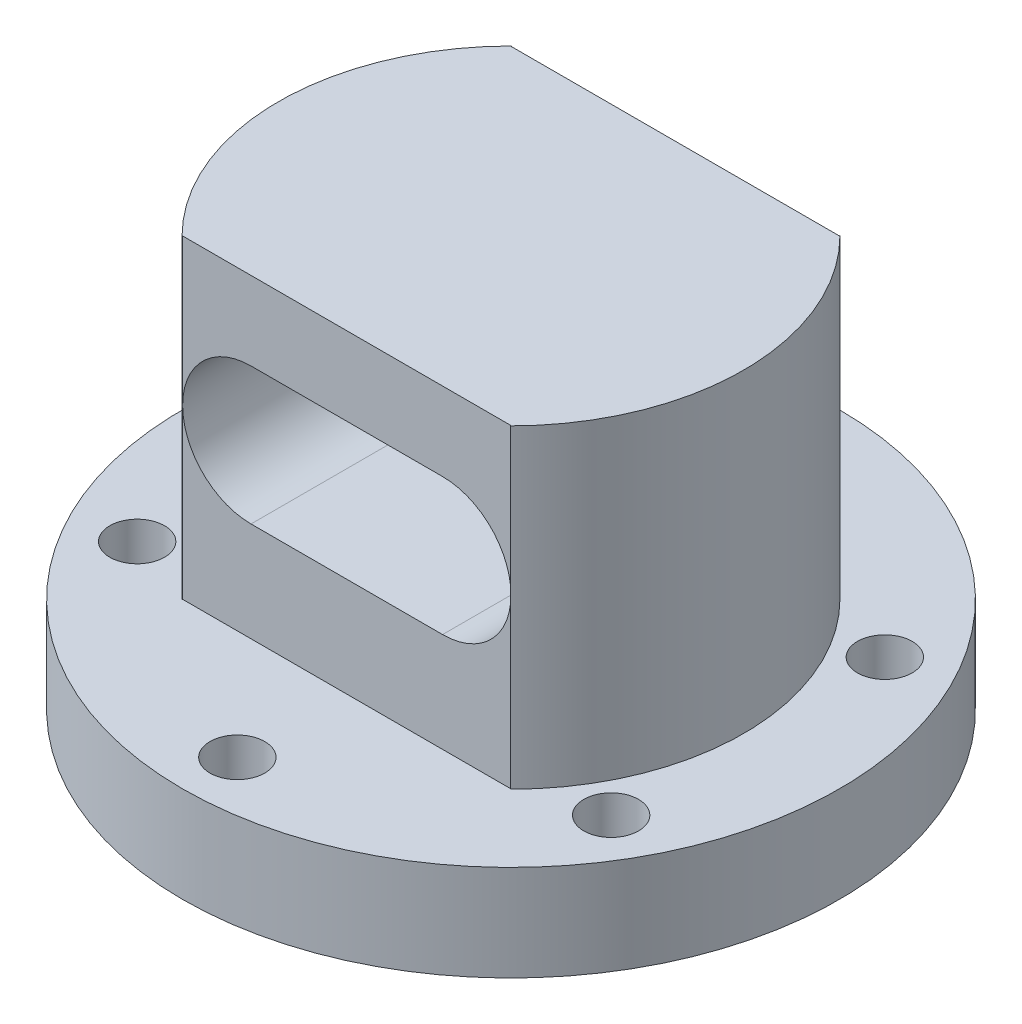
ISO-10303-21;
HEADER;
FILE_DESCRIPTION(('STEP AP214'),'2;1');
FILE_NAME('part.step','',(''),(''),'','','');
FILE_SCHEMA(('AUTOMOTIVE_DESIGN { 1 0 10303 214 1 1 1 1 }'));
ENDSEC;
DATA;
#1=APPLICATION_CONTEXT('core data for automotive mechanical design processes');
#2=APPLICATION_PROTOCOL_DEFINITION('international standard','automotive_design',2000,#1);
#3=PRODUCT_CONTEXT('',#1,'mechanical');
#4=PRODUCT('Part','Part','',(#3));
#5=PRODUCT_RELATED_PRODUCT_CATEGORY('part','',(#4));
#6=PRODUCT_DEFINITION_FORMATION('','',#4);
#7=PRODUCT_DEFINITION_CONTEXT('part definition',#1,'design');
#8=PRODUCT_DEFINITION('design','',#6,#7);
#9=PRODUCT_DEFINITION_SHAPE('','',#8);
#10=(LENGTH_UNIT() NAMED_UNIT(*) SI_UNIT(.MILLI.,.METRE.));
#11=(NAMED_UNIT(*) PLANE_ANGLE_UNIT() SI_UNIT($,.RADIAN.));
#12=(NAMED_UNIT(*) SI_UNIT($,.STERADIAN.) SOLID_ANGLE_UNIT());
#13=UNCERTAINTY_MEASURE_WITH_UNIT(LENGTH_MEASURE(1.E-05),#10,'distance_accuracy_value','');
#14=(GEOMETRIC_REPRESENTATION_CONTEXT(3) GLOBAL_UNCERTAINTY_ASSIGNED_CONTEXT((#13)) GLOBAL_UNIT_ASSIGNED_CONTEXT((#10,
#11,#12)) REPRESENTATION_CONTEXT('',''));
#15=CARTESIAN_POINT('',(0.,0.,0.));
#16=DIRECTION('',(0.,0.,1.));
#17=DIRECTION('',(1.,0.,0.));
#18=AXIS2_PLACEMENT_3D('',#15,#16,#17);
#19=CARTESIAN_POINT('',(0.,30.,0.));
#20=DIRECTION('',(0.,-1.,0.));
#21=DIRECTION('',(0.,0.,-1.));
#22=AXIS2_PLACEMENT_3D('',#19,#20,#21);
#23=CYLINDRICAL_SURFACE('',#22,17.);
#24=CARTESIAN_POINT('',(0.,30.,0.));
#25=DIRECTION('',(0.,1.,0.));
#26=DIRECTION('',(0.,0.,1.));
#27=AXIS2_PLACEMENT_3D('',#24,#25,#26);
#28=CIRCLE('',#27,17.);
#29=CARTESIAN_POINT('',(11.9999999999999,30.,12.0415945787924));
#30=VERTEX_POINT('',#29);
#31=CARTESIAN_POINT('',(11.9999999999999,30.,-12.0415945787924));
#32=VERTEX_POINT('',#31);
#33=EDGE_CURVE('E237',#30,#32,#28,.T.);
#34=ORIENTED_EDGE('',*,*,#33,.F.);
#35=DIRECTION('',(0.,-1.,0.));
#36=VECTOR('',#35,1.);
#37=CARTESIAN_POINT('',(11.9999999999999,30.,12.0415945787924));
#38=LINE('',#37,#36);
#39=CARTESIAN_POINT('',(11.9999999999999,7.,12.0415945787924));
#40=VERTEX_POINT('',#39);
#41=EDGE_CURVE('E139',#30,#40,#38,.T.);
#42=ORIENTED_EDGE('',*,*,#41,.T.);
#43=CARTESIAN_POINT('',(0.,7.,0.));
#44=DIRECTION('',(0.,1.,0.));
#45=DIRECTION('',(0.,0.,1.));
#46=AXIS2_PLACEMENT_3D('',#43,#44,#45);
#47=CIRCLE('',#46,17.);
#48=CARTESIAN_POINT('',(11.9999999999999,7.,-12.0415945787924));
#49=VERTEX_POINT('',#48);
#50=EDGE_CURVE('E225',#40,#49,#47,.T.);
#51=ORIENTED_EDGE('',*,*,#50,.T.);
#52=DIRECTION('',(0.,-1.,0.));
#53=VECTOR('',#52,1.);
#54=CARTESIAN_POINT('',(11.9999999999999,30.,-12.0415945787924));
#55=LINE('',#54,#53);
#56=EDGE_CURVE('E216',#49,#32,#55,.F.);
#57=ORIENTED_EDGE('',*,*,#56,.T.);
#58=EDGE_LOOP('',(#34,#42,#51,#57));
#59=FACE_BOUND('',#58,.T.);
#60=ADVANCED_FACE('F31',(#59),#23,.T.);
#61=CARTESIAN_POINT('',(0.,7.,0.));
#62=DIRECTION('',(0.,1.,0.));
#63=DIRECTION('',(0.,0.,1.));
#64=AXIS2_PLACEMENT_3D('',#61,#62,#63);
#65=PLANE('',#64);
#66=CARTESIAN_POINT('',(-17.3205080756886,7.,-10.0000000000003));
#67=DIRECTION('',(0.,1.,0.));
#68=DIRECTION('',(0.,0.,1.));
#69=AXIS2_PLACEMENT_3D('',#66,#67,#68);
#70=CIRCLE('',#69,2.);
#71=CARTESIAN_POINT('',(-17.3205080756886,7.,-8.00000000000034));
#72=VERTEX_POINT('',#71);
#73=EDGE_CURVE('E295',#72,#72,#70,.T.);
#74=ORIENTED_EDGE('',*,*,#73,.F.);
#75=EDGE_LOOP('',(#74));
#76=FACE_BOUND('',#75,.T.);
#77=CARTESIAN_POINT('',(-17.3205080756884,7.,10.0000000000001));
#78=DIRECTION('',(0.,1.,0.));
#79=DIRECTION('',(0.,0.,1.));
#80=AXIS2_PLACEMENT_3D('',#77,#78,#79);
#81=CIRCLE('',#80,2.00000000000066);
#82=CARTESIAN_POINT('',(-17.3205080756884,7.,12.0000000000008));
#83=VERTEX_POINT('',#82);
#84=EDGE_CURVE('E289',#83,#83,#81,.T.);
#85=ORIENTED_EDGE('',*,*,#84,.F.);
#86=EDGE_LOOP('',(#85));
#87=FACE_BOUND('',#86,.T.);
#88=CARTESIAN_POINT('',(4.19972813917192E-13,7.,20.));
#89=DIRECTION('',(0.,1.,0.));
#90=DIRECTION('',(0.,0.,1.));
#91=AXIS2_PLACEMENT_3D('',#88,#89,#90);
#92=CIRCLE('',#91,2.00000000000067);
#93=CARTESIAN_POINT('',(4.19972813917192E-13,7.,22.0000000000007));
#94=VERTEX_POINT('',#93);
#95=EDGE_CURVE('E283',#94,#94,#92,.T.);
#96=ORIENTED_EDGE('',*,*,#95,.F.);
#97=EDGE_LOOP('',(#96));
#98=FACE_BOUND('',#97,.T.);
#99=CARTESIAN_POINT('',(17.3205080756891,7.,9.99999999999989));
#100=DIRECTION('',(0.,1.,0.));
#101=DIRECTION('',(0.,0.,1.));
#102=AXIS2_PLACEMENT_3D('',#99,#100,#101);
#103=CIRCLE('',#102,2.00000000000042);
#104=CARTESIAN_POINT('',(17.3205080756891,7.,12.0000000000003));
#105=VERTEX_POINT('',#104);
#106=EDGE_CURVE('E277',#105,#105,#103,.T.);
#107=ORIENTED_EDGE('',*,*,#106,.F.);
#108=EDGE_LOOP('',(#107));
#109=FACE_BOUND('',#108,.T.);
#110=CARTESIAN_POINT('',(17.3205080756889,7.,-9.99999999999985));
#111=DIRECTION('',(0.,1.,0.));
#112=DIRECTION('',(0.,0.,1.));
#113=AXIS2_PLACEMENT_3D('',#110,#111,#112);
#114=CIRCLE('',#113,2.);
#115=CARTESIAN_POINT('',(17.3205080756889,7.,-7.99999999999985));
#116=VERTEX_POINT('',#115);
#117=EDGE_CURVE('E271',#116,#116,#114,.T.);
#118=ORIENTED_EDGE('',*,*,#117,.F.);
#119=EDGE_LOOP('',(#118));
#120=FACE_BOUND('',#119,.T.);
#121=CARTESIAN_POINT('',(1.39659334444375E-13,7.,-20.));
#122=DIRECTION('',(0.,1.,0.));
#123=DIRECTION('',(0.,0.,1.));
#124=AXIS2_PLACEMENT_3D('',#121,#122,#123);
#125=CIRCLE('',#124,2.);
#126=CARTESIAN_POINT('',(1.39659334444375E-13,7.,-18.));
#127=VERTEX_POINT('',#126);
#128=EDGE_CURVE('E159',#127,#127,#125,.T.);
#129=ORIENTED_EDGE('',*,*,#128,.F.);
#130=EDGE_LOOP('',(#129));
#131=FACE_BOUND('',#130,.T.);
#132=ORIENTED_EDGE('',*,*,#50,.F.);
#133=DIRECTION('',(0.,0.,1.));
#134=VECTOR('',#133,1.);
#135=CARTESIAN_POINT('',(11.9999999999999,7.,12.));
#136=LINE('',#135,#134);
#137=CARTESIAN_POINT('',(11.9999999999999,7.,12.));
#138=VERTEX_POINT('',#137);
#139=EDGE_CURVE('E165',#138,#40,#136,.T.);
#140=ORIENTED_EDGE('',*,*,#139,.F.);
#141=DIRECTION('',(1.,0.,0.));
#142=VECTOR('',#141,1.);
#143=CARTESIAN_POINT('',(-12.,7.,12.));
#144=LINE('',#143,#142);
#145=CARTESIAN_POINT('',(-12.,7.,12.));
#146=VERTEX_POINT('',#145);
#147=EDGE_CURVE('E162',#146,#138,#144,.T.);
#148=ORIENTED_EDGE('',*,*,#147,.F.);
#149=DIRECTION('',(0.,0.,-1.));
#150=VECTOR('',#149,1.);
#151=CARTESIAN_POINT('',(-12.,7.,20.031532799044));
#152=LINE('',#151,#150);
#153=CARTESIAN_POINT('',(-12.,7.,12.0415945787923));
#154=VERTEX_POINT('',#153);
#155=EDGE_CURVE('E168',#154,#146,#152,.T.);
#156=ORIENTED_EDGE('',*,*,#155,.F.);
#157=CARTESIAN_POINT('',(-12.,7.,-12.0415945787923));
#158=VERTEX_POINT('',#157);
#159=EDGE_CURVE('E238',#158,#154,#47,.T.);
#160=ORIENTED_EDGE('',*,*,#159,.F.);
#161=DIRECTION('',(0.,0.,-1.));
#162=VECTOR('',#161,1.);
#163=CARTESIAN_POINT('',(-12.,7.,-20.031532799044));
#164=LINE('',#163,#162);
#165=CARTESIAN_POINT('',(-12.,7.,-12.));
#166=VERTEX_POINT('',#165);
#167=EDGE_CURVE('E184',#166,#158,#164,.T.);
#168=ORIENTED_EDGE('',*,*,#167,.F.);
#169=DIRECTION('',(-1.,0.,0.));
#170=VECTOR('',#169,1.);
#171=CARTESIAN_POINT('',(-12.,7.,-12.));
#172=LINE('',#171,#170);
#173=CARTESIAN_POINT('',(11.9999999999999,7.,-12.));
#174=VERTEX_POINT('',#173);
#175=EDGE_CURVE('E188',#174,#166,#172,.T.);
#176=ORIENTED_EDGE('',*,*,#175,.F.);
#177=DIRECTION('',(0.,0.,1.));
#178=VECTOR('',#177,1.);
#179=CARTESIAN_POINT('',(11.9999999999999,7.,-12.));
#180=LINE('',#179,#178);
#181=EDGE_CURVE('E182',#49,#174,#180,.T.);
#182=ORIENTED_EDGE('',*,*,#181,.F.);
#183=EDGE_LOOP('',(#132,#140,#148,#156,#160,#168,#176,#182));
#184=FACE_BOUND('',#183,.T.);
#185=CARTESIAN_POINT('',(0.,7.,0.));
#186=DIRECTION('',(0.,1.,0.));
#187=DIRECTION('',(0.,0.,1.));
#188=AXIS2_PLACEMENT_3D('',#185,#186,#187);
#189=CIRCLE('',#188,24.);
#190=CARTESIAN_POINT('',(0.,7.,24.));
#191=VERTEX_POINT('',#190);
#192=EDGE_CURVE('E241',#191,#191,#189,.T.);
#193=ORIENTED_EDGE('',*,*,#192,.T.);
#194=EDGE_LOOP('',(#193));
#195=FACE_BOUND('',#194,.T.);
#196=ADVANCED_FACE('F265',(#76,#87,#98,#109,#120,#131,#184,#195),#65,.T.);
#197=CARTESIAN_POINT('',(0.,7.,0.));
#198=DIRECTION('',(0.,-1.,0.));
#199=DIRECTION('',(0.,0.,-1.));
#200=AXIS2_PLACEMENT_3D('',#197,#198,#199);
#201=CYLINDRICAL_SURFACE('',#200,24.);
#202=ORIENTED_EDGE('',*,*,#192,.F.);
#203=EDGE_LOOP('',(#202));
#204=FACE_BOUND('',#203,.T.);
#205=CARTESIAN_POINT('',(0.,0.,0.));
#206=DIRECTION('',(0.,1.,0.));
#207=DIRECTION('',(0.,0.,1.));
#208=AXIS2_PLACEMENT_3D('',#205,#206,#207);
#209=CIRCLE('',#208,24.);
#210=CARTESIAN_POINT('',(0.,0.,24.));
#211=VERTEX_POINT('',#210);
#212=EDGE_CURVE('E236',#211,#211,#209,.T.);
#213=ORIENTED_EDGE('',*,*,#212,.T.);
#214=EDGE_LOOP('',(#213));
#215=FACE_BOUND('',#214,.T.);
#216=ADVANCED_FACE('F33',(#204,#215),#201,.T.);
#217=CARTESIAN_POINT('',(0.,0.,0.));
#218=DIRECTION('',(0.,1.,0.));
#219=DIRECTION('',(0.,0.,1.));
#220=AXIS2_PLACEMENT_3D('',#217,#218,#219);
#221=PLANE('',#220);
#222=CARTESIAN_POINT('',(-17.3205080756886,0.,-10.0000000000003));
#223=DIRECTION('',(0.,1.,0.));
#224=DIRECTION('',(0.,0.,1.));
#225=AXIS2_PLACEMENT_3D('',#222,#223,#224);
#226=CIRCLE('',#225,2.);
#227=CARTESIAN_POINT('',(-17.3205080756886,0.,-8.00000000000034));
#228=VERTEX_POINT('',#227);
#229=EDGE_CURVE('E292',#228,#228,#226,.T.);
#230=ORIENTED_EDGE('',*,*,#229,.T.);
#231=EDGE_LOOP('',(#230));
#232=FACE_BOUND('',#231,.T.);
#233=CARTESIAN_POINT('',(-17.3205080756884,0.,10.0000000000001));
#234=DIRECTION('',(0.,1.,0.));
#235=DIRECTION('',(0.,0.,1.));
#236=AXIS2_PLACEMENT_3D('',#233,#234,#235);
#237=CIRCLE('',#236,2.00000000000066);
#238=CARTESIAN_POINT('',(-17.3205080756884,0.,12.0000000000008));
#239=VERTEX_POINT('',#238);
#240=EDGE_CURVE('E286',#239,#239,#237,.T.);
#241=ORIENTED_EDGE('',*,*,#240,.T.);
#242=EDGE_LOOP('',(#241));
#243=FACE_BOUND('',#242,.T.);
#244=CARTESIAN_POINT('',(4.19972813917192E-13,0.,20.));
#245=DIRECTION('',(0.,1.,0.));
#246=DIRECTION('',(0.,0.,1.));
#247=AXIS2_PLACEMENT_3D('',#244,#245,#246);
#248=CIRCLE('',#247,2.00000000000067);
#249=CARTESIAN_POINT('',(4.19972813917192E-13,0.,22.0000000000007));
#250=VERTEX_POINT('',#249);
#251=EDGE_CURVE('E280',#250,#250,#248,.T.);
#252=ORIENTED_EDGE('',*,*,#251,.T.);
#253=EDGE_LOOP('',(#252));
#254=FACE_BOUND('',#253,.T.);
#255=CARTESIAN_POINT('',(17.3205080756891,0.,9.99999999999989));
#256=DIRECTION('',(0.,1.,0.));
#257=DIRECTION('',(0.,0.,1.));
#258=AXIS2_PLACEMENT_3D('',#255,#256,#257);
#259=CIRCLE('',#258,2.00000000000042);
#260=CARTESIAN_POINT('',(17.3205080756891,0.,12.0000000000003));
#261=VERTEX_POINT('',#260);
#262=EDGE_CURVE('E274',#261,#261,#259,.T.);
#263=ORIENTED_EDGE('',*,*,#262,.T.);
#264=EDGE_LOOP('',(#263));
#265=FACE_BOUND('',#264,.T.);
#266=CARTESIAN_POINT('',(17.3205080756889,0.,-9.99999999999985));
#267=DIRECTION('',(0.,1.,0.));
#268=DIRECTION('',(0.,0.,1.));
#269=AXIS2_PLACEMENT_3D('',#266,#267,#268);
#270=CIRCLE('',#269,2.);
#271=CARTESIAN_POINT('',(17.3205080756889,0.,-7.99999999999985));
#272=VERTEX_POINT('',#271);
#273=EDGE_CURVE('E269',#272,#272,#270,.T.);
#274=ORIENTED_EDGE('',*,*,#273,.T.);
#275=EDGE_LOOP('',(#274));
#276=FACE_BOUND('',#275,.T.);
#277=CARTESIAN_POINT('',(1.39659334444375E-13,0.,-20.));
#278=DIRECTION('',(0.,1.,0.));
#279=DIRECTION('',(0.,0.,1.));
#280=AXIS2_PLACEMENT_3D('',#277,#278,#279);
#281=CIRCLE('',#280,2.);
#282=CARTESIAN_POINT('',(1.39659334444375E-13,0.,-18.));
#283=VERTEX_POINT('',#282);
#284=EDGE_CURVE('E155',#283,#283,#281,.T.);
#285=ORIENTED_EDGE('',*,*,#284,.T.);
#286=EDGE_LOOP('',(#285));
#287=FACE_BOUND('',#286,.T.);
#288=ORIENTED_EDGE('',*,*,#212,.F.);
#289=EDGE_LOOP('',(#288));
#290=FACE_BOUND('',#289,.T.);
#291=ADVANCED_FACE('F301',(#232,#243,#254,#265,#276,#287,#290),#221,.F.);
#292=ORIENTED_EDGE('',*,*,#159,.T.);
#293=DIRECTION('',(0.,-1.,0.));
#294=VECTOR('',#293,1.);
#295=CARTESIAN_POINT('',(-12.,30.,12.0415945787923));
#296=LINE('',#295,#294);
#297=CARTESIAN_POINT('',(-12.,30.,12.0415945787923));
#298=VERTEX_POINT('',#297);
#299=EDGE_CURVE('E179',#154,#298,#296,.F.);
#300=ORIENTED_EDGE('',*,*,#299,.T.);
#301=CARTESIAN_POINT('',(-12.,30.,-12.0415945787923));
#302=VERTEX_POINT('',#301);
#303=EDGE_CURVE('E234',#302,#298,#28,.T.);
#304=ORIENTED_EDGE('',*,*,#303,.F.);
#305=DIRECTION('',(0.,-1.,0.));
#306=VECTOR('',#305,1.);
#307=CARTESIAN_POINT('',(-12.,30.,-12.0415945787923));
#308=LINE('',#307,#306);
#309=EDGE_CURVE('E219',#302,#158,#308,.T.);
#310=ORIENTED_EDGE('',*,*,#309,.T.);
#311=EDGE_LOOP('',(#292,#300,#304,#310));
#312=FACE_BOUND('',#311,.T.);
#313=ADVANCED_FACE('F342',(#312),#23,.T.);
#314=CARTESIAN_POINT('',(0.,30.,0.));
#315=DIRECTION('',(0.,1.,0.));
#316=DIRECTION('',(0.,0.,1.));
#317=AXIS2_PLACEMENT_3D('',#314,#315,#316);
#318=PLANE('',#317);
#319=DIRECTION('',(0.,0.,-1.));
#320=VECTOR('',#319,1.);
#321=CARTESIAN_POINT('',(11.9999999999999,30.,12.));
#322=LINE('',#321,#320);
#323=CARTESIAN_POINT('',(11.9999999999999,30.,12.));
#324=VERTEX_POINT('',#323);
#325=EDGE_CURVE('E134',#30,#324,#322,.T.);
#326=ORIENTED_EDGE('',*,*,#325,.F.);
#327=ORIENTED_EDGE('',*,*,#33,.T.);
#328=DIRECTION('',(0.,0.,-1.));
#329=VECTOR('',#328,1.);
#330=CARTESIAN_POINT('',(11.9999999999999,30.,-12.));
#331=LINE('',#330,#329);
#332=CARTESIAN_POINT('',(11.9999999999999,30.,-12.));
#333=VERTEX_POINT('',#332);
#334=EDGE_CURVE('E194',#333,#32,#331,.T.);
#335=ORIENTED_EDGE('',*,*,#334,.F.);
#336=DIRECTION('',(1.,0.,0.));
#337=VECTOR('',#336,1.);
#338=CARTESIAN_POINT('',(-12.,30.,-12.));
#339=LINE('',#338,#337);
#340=CARTESIAN_POINT('',(-12.,30.,-12.));
#341=VERTEX_POINT('',#340);
#342=EDGE_CURVE('E191',#341,#333,#339,.T.);
#343=ORIENTED_EDGE('',*,*,#342,.F.);
#344=DIRECTION('',(0.,0.,1.));
#345=VECTOR('',#344,1.);
#346=CARTESIAN_POINT('',(-12.,30.,-20.031532799044));
#347=LINE('',#346,#345);
#348=EDGE_CURVE('E181',#302,#341,#347,.T.);
#349=ORIENTED_EDGE('',*,*,#348,.F.);
#350=ORIENTED_EDGE('',*,*,#303,.T.);
#351=DIRECTION('',(0.,0.,1.));
#352=VECTOR('',#351,1.);
#353=CARTESIAN_POINT('',(-12.,30.,20.031532799044));
#354=LINE('',#353,#352);
#355=CARTESIAN_POINT('',(-12.,30.,12.));
#356=VERTEX_POINT('',#355);
#357=EDGE_CURVE('E143',#356,#298,#354,.T.);
#358=ORIENTED_EDGE('',*,*,#357,.F.);
#359=DIRECTION('',(-1.,0.,0.));
#360=VECTOR('',#359,1.);
#361=CARTESIAN_POINT('',(-12.,30.,12.));
#362=LINE('',#361,#360);
#363=EDGE_CURVE('E46',#324,#356,#362,.T.);
#364=ORIENTED_EDGE('',*,*,#363,.F.);
#365=EDGE_LOOP('',(#326,#327,#335,#343,#349,#350,#358,#364));
#366=FACE_BOUND('',#365,.T.);
#367=ADVANCED_FACE('F152',(#366),#318,.T.);
#368=CARTESIAN_POINT('',(-7.,19.2696781788091,-23.));
#369=DIRECTION('',(0.,0.,1.));
#370=DIRECTION('',(1.,0.,0.));
#371=AXIS2_PLACEMENT_3D('',#368,#369,#370);
#372=CYLINDRICAL_SURFACE('',#371,5.);
#373=CARTESIAN_POINT('',(-7.,19.2696781788091,12.));
#374=DIRECTION('',(0.,0.,-1.));
#375=DIRECTION('',(-1.,0.,0.));
#376=AXIS2_PLACEMENT_3D('',#373,#374,#375);
#377=CIRCLE('',#376,5.);
#378=CARTESIAN_POINT('',(-7.,24.2696781788091,12.));
#379=VERTEX_POINT('',#378);
#380=CARTESIAN_POINT('',(-12.,19.2696781788091,12.));
#381=VERTEX_POINT('',#380);
#382=EDGE_CURVE('E174',#379,#381,#377,.F.);
#383=ORIENTED_EDGE('',*,*,#382,.T.);
#384=CARTESIAN_POINT('',(-7.,14.2696781788091,12.));
#385=VERTEX_POINT('',#384);
#386=EDGE_CURVE('E177',#381,#385,#377,.F.);
#387=ORIENTED_EDGE('',*,*,#386,.T.);
#388=DIRECTION('',(0.,0.,1.));
#389=VECTOR('',#388,1.);
#390=CARTESIAN_POINT('',(-7.,14.2696781788091,-23.));
#391=LINE('',#390,#389);
#392=CARTESIAN_POINT('',(-7.,14.2696781788091,-12.));
#393=VERTEX_POINT('',#392);
#394=EDGE_CURVE('E221',#393,#385,#391,.T.);
#395=ORIENTED_EDGE('',*,*,#394,.F.);
#396=CARTESIAN_POINT('',(-7.,19.2696781788091,-12.));
#397=DIRECTION('',(0.,0.,1.));
#398=DIRECTION('',(1.,0.,0.));
#399=AXIS2_PLACEMENT_3D('',#396,#397,#398);
#400=CIRCLE('',#399,5.);
#401=CARTESIAN_POINT('',(-12.,19.2696781788091,-12.));
#402=VERTEX_POINT('',#401);
#403=EDGE_CURVE('E208',#393,#402,#400,.F.);
#404=ORIENTED_EDGE('',*,*,#403,.T.);
#405=CARTESIAN_POINT('',(-7.,24.2696781788091,-12.));
#406=VERTEX_POINT('',#405);
#407=EDGE_CURVE('E212',#402,#406,#400,.F.);
#408=ORIENTED_EDGE('',*,*,#407,.T.);
#409=DIRECTION('',(0.,0.,1.));
#410=VECTOR('',#409,1.);
#411=CARTESIAN_POINT('',(-7.,24.2696781788091,-23.));
#412=LINE('',#411,#410);
#413=EDGE_CURVE('E222',#406,#379,#412,.T.);
#414=ORIENTED_EDGE('',*,*,#413,.T.);
#415=EDGE_LOOP('',(#383,#387,#395,#404,#408,#414));
#416=FACE_BOUND('',#415,.T.);
#417=ADVANCED_FACE('F253',(#416),#372,.F.);
#418=CARTESIAN_POINT('',(-7.,24.2696781788091,-23.));
#419=DIRECTION('',(0.,1.,0.));
#420=DIRECTION('',(-1.,0.,0.));
#421=AXIS2_PLACEMENT_3D('',#418,#419,#420);
#422=PLANE('',#421);
#423=DIRECTION('',(0.,0.,1.));
#424=VECTOR('',#423,1.);
#425=CARTESIAN_POINT('',(7.,24.2696781788091,-23.));
#426=LINE('',#425,#424);
#427=CARTESIAN_POINT('',(7.,24.2696781788091,-12.));
#428=VERTEX_POINT('',#427);
#429=CARTESIAN_POINT('',(7.,24.2696781788091,12.));
#430=VERTEX_POINT('',#429);
#431=EDGE_CURVE('E226',#428,#430,#426,.T.);
#432=ORIENTED_EDGE('',*,*,#431,.T.);
#433=DIRECTION('',(-1.,0.,0.));
#434=VECTOR('',#433,1.);
#435=CARTESIAN_POINT('',(-6.99999999999999,24.2696781788091,12.));
#436=LINE('',#435,#434);
#437=EDGE_CURVE('E171',#430,#379,#436,.T.);
#438=ORIENTED_EDGE('',*,*,#437,.T.);
#439=ORIENTED_EDGE('',*,*,#413,.F.);
#440=DIRECTION('',(1.,0.,0.));
#441=VECTOR('',#440,1.);
#442=CARTESIAN_POINT('',(-7.,24.2696781788091,-12.));
#443=LINE('',#442,#441);
#444=EDGE_CURVE('E213',#406,#428,#443,.T.);
#445=ORIENTED_EDGE('',*,*,#444,.T.);
#446=EDGE_LOOP('',(#432,#438,#439,#445));
#447=FACE_BOUND('',#446,.T.);
#448=ADVANCED_FACE('F375',(#447),#422,.F.);
#449=CARTESIAN_POINT('',(7.,19.2696781788091,-23.));
#450=DIRECTION('',(0.,0.,1.));
#451=DIRECTION('',(1.,0.,0.));
#452=AXIS2_PLACEMENT_3D('',#449,#450,#451);
#453=CYLINDRICAL_SURFACE('',#452,5.);
#454=CARTESIAN_POINT('',(7.,19.2696781788091,12.));
#455=DIRECTION('',(0.,0.,-1.));
#456=DIRECTION('',(-1.,0.,0.));
#457=AXIS2_PLACEMENT_3D('',#454,#455,#456);
#458=CIRCLE('',#457,5.);
#459=CARTESIAN_POINT('',(7.,14.2696781788091,12.));
#460=VERTEX_POINT('',#459);
#461=CARTESIAN_POINT('',(11.9999999999999,19.2696781788091,12.));
#462=VERTEX_POINT('',#461);
#463=EDGE_CURVE('E54',#460,#462,#458,.F.);
#464=ORIENTED_EDGE('',*,*,#463,.T.);
#465=EDGE_CURVE('E147',#462,#430,#458,.F.);
#466=ORIENTED_EDGE('',*,*,#465,.T.);
#467=ORIENTED_EDGE('',*,*,#431,.F.);
#468=CARTESIAN_POINT('',(7.,19.2696781788091,-12.));
#469=DIRECTION('',(0.,0.,1.));
#470=DIRECTION('',(1.,0.,0.));
#471=AXIS2_PLACEMENT_3D('',#468,#469,#470);
#472=CIRCLE('',#471,5.);
#473=CARTESIAN_POINT('',(11.9999999999999,19.2696781788091,-12.));
#474=VERTEX_POINT('',#473);
#475=EDGE_CURVE('E209',#428,#474,#472,.F.);
#476=ORIENTED_EDGE('',*,*,#475,.T.);
#477=CARTESIAN_POINT('',(7.,14.2696781788091,-12.));
#478=VERTEX_POINT('',#477);
#479=EDGE_CURVE('E205',#474,#478,#472,.F.);
#480=ORIENTED_EDGE('',*,*,#479,.T.);
#481=DIRECTION('',(0.,0.,1.));
#482=VECTOR('',#481,1.);
#483=CARTESIAN_POINT('',(7.,14.2696781788091,-23.));
#484=LINE('',#483,#482);
#485=EDGE_CURVE('E229',#478,#460,#484,.T.);
#486=ORIENTED_EDGE('',*,*,#485,.T.);
#487=EDGE_LOOP('',(#464,#466,#467,#476,#480,#486));
#488=FACE_BOUND('',#487,.T.);
#489=ADVANCED_FACE('F371',(#488),#453,.F.);
#490=CARTESIAN_POINT('',(-7.,14.2696781788091,-23.));
#491=DIRECTION('',(0.,-1.,0.));
#492=DIRECTION('',(1.,0.,0.));
#493=AXIS2_PLACEMENT_3D('',#490,#491,#492);
#494=PLANE('',#493);
#495=ORIENTED_EDGE('',*,*,#394,.T.);
#496=DIRECTION('',(1.,0.,0.));
#497=VECTOR('',#496,1.);
#498=CARTESIAN_POINT('',(-6.99999999999999,14.2696781788091,12.));
#499=LINE('',#498,#497);
#500=EDGE_CURVE('E11',#385,#460,#499,.T.);
#501=ORIENTED_EDGE('',*,*,#500,.T.);
#502=ORIENTED_EDGE('',*,*,#485,.F.);
#503=DIRECTION('',(-1.,0.,0.));
#504=VECTOR('',#503,1.);
#505=CARTESIAN_POINT('',(-7.,14.2696781788091,-12.));
#506=LINE('',#505,#504);
#507=EDGE_CURVE('E39',#478,#393,#506,.T.);
#508=ORIENTED_EDGE('',*,*,#507,.T.);
#509=EDGE_LOOP('',(#495,#501,#502,#508));
#510=FACE_BOUND('',#509,.T.);
#511=ADVANCED_FACE('F249',(#510),#494,.F.);
#512=CARTESIAN_POINT('',(-12.,-18.3082105077012,-20.031532799044));
#513=DIRECTION('',(-1.,0.,0.));
#514=DIRECTION('',(0.,0.,1.));
#515=AXIS2_PLACEMENT_3D('',#512,#513,#514);
#516=PLANE('',#515);
#517=ORIENTED_EDGE('',*,*,#348,.T.);
#518=DIRECTION('',(0.,1.,0.));
#519=VECTOR('',#518,1.);
#520=CARTESIAN_POINT('',(-12.,-18.3082105077012,-12.));
#521=LINE('',#520,#519);
#522=EDGE_CURVE('E197',#402,#341,#521,.T.);
#523=ORIENTED_EDGE('',*,*,#522,.F.);
#524=EDGE_CURVE('E201',#166,#402,#521,.T.);
#525=ORIENTED_EDGE('',*,*,#524,.F.);
#526=ORIENTED_EDGE('',*,*,#167,.T.);
#527=ORIENTED_EDGE('',*,*,#309,.F.);
#528=EDGE_LOOP('',(#517,#523,#525,#526,#527));
#529=FACE_BOUND('',#528,.T.);
#530=ADVANCED_FACE('F361',(#529),#516,.F.);
#531=CARTESIAN_POINT('',(11.9999999999999,-18.3082105077012,-12.));
#532=DIRECTION('',(1.,0.,0.));
#533=DIRECTION('',(0.,0.,-1.));
#534=AXIS2_PLACEMENT_3D('',#531,#532,#533);
#535=PLANE('',#534);
#536=ORIENTED_EDGE('',*,*,#181,.T.);
#537=DIRECTION('',(0.,1.,0.));
#538=VECTOR('',#537,1.);
#539=CARTESIAN_POINT('',(11.9999999999999,-18.3082105077012,-12.));
#540=LINE('',#539,#538);
#541=EDGE_CURVE('E185',#174,#474,#540,.T.);
#542=ORIENTED_EDGE('',*,*,#541,.T.);
#543=EDGE_CURVE('E200',#474,#333,#540,.T.);
#544=ORIENTED_EDGE('',*,*,#543,.T.);
#545=ORIENTED_EDGE('',*,*,#334,.T.);
#546=ORIENTED_EDGE('',*,*,#56,.F.);
#547=EDGE_LOOP('',(#536,#542,#544,#545,#546));
#548=FACE_BOUND('',#547,.T.);
#549=ADVANCED_FACE('F367',(#548),#535,.F.);
#550=CARTESIAN_POINT('',(-12.,-18.3082105077012,-12.));
#551=DIRECTION('',(0.,0.,1.));
#552=DIRECTION('',(1.,0.,0.));
#553=AXIS2_PLACEMENT_3D('',#550,#551,#552);
#554=PLANE('',#553);
#555=ORIENTED_EDGE('',*,*,#407,.F.);
#556=ORIENTED_EDGE('',*,*,#522,.T.);
#557=ORIENTED_EDGE('',*,*,#342,.T.);
#558=ORIENTED_EDGE('',*,*,#543,.F.);
#559=ORIENTED_EDGE('',*,*,#475,.F.);
#560=ORIENTED_EDGE('',*,*,#444,.F.);
#561=EDGE_LOOP('',(#555,#556,#557,#558,#559,#560));
#562=FACE_BOUND('',#561,.T.);
#563=ADVANCED_FACE('F376',(#562),#554,.F.);
#564=ORIENTED_EDGE('',*,*,#507,.F.);
#565=ORIENTED_EDGE('',*,*,#479,.F.);
#566=ORIENTED_EDGE('',*,*,#541,.F.);
#567=ORIENTED_EDGE('',*,*,#175,.T.);
#568=ORIENTED_EDGE('',*,*,#524,.T.);
#569=ORIENTED_EDGE('',*,*,#403,.F.);
#570=EDGE_LOOP('',(#564,#565,#566,#567,#568,#569));
#571=FACE_BOUND('',#570,.T.);
#572=ADVANCED_FACE('F362',(#571),#554,.F.);
#573=CARTESIAN_POINT('',(-12.,-18.3082105077012,20.031532799044));
#574=DIRECTION('',(-1.,0.,0.));
#575=DIRECTION('',(0.,0.,1.));
#576=AXIS2_PLACEMENT_3D('',#573,#574,#575);
#577=PLANE('',#576);
#578=ORIENTED_EDGE('',*,*,#155,.T.);
#579=DIRECTION('',(0.,1.,0.));
#580=VECTOR('',#579,1.);
#581=CARTESIAN_POINT('',(-12.,-18.3082105077012,12.));
#582=LINE('',#581,#580);
#583=EDGE_CURVE('E149',#146,#381,#582,.T.);
#584=ORIENTED_EDGE('',*,*,#583,.T.);
#585=EDGE_CURVE('E142',#381,#356,#582,.T.);
#586=ORIENTED_EDGE('',*,*,#585,.T.);
#587=ORIENTED_EDGE('',*,*,#357,.T.);
#588=ORIENTED_EDGE('',*,*,#299,.F.);
#589=EDGE_LOOP('',(#578,#584,#586,#587,#588));
#590=FACE_BOUND('',#589,.T.);
#591=ADVANCED_FACE('F258',(#590),#577,.F.);
#592=CARTESIAN_POINT('',(11.9999999999999,-18.3082105077012,12.));
#593=DIRECTION('',(1.,0.,0.));
#594=DIRECTION('',(0.,0.,-1.));
#595=AXIS2_PLACEMENT_3D('',#592,#593,#594);
#596=PLANE('',#595);
#597=ORIENTED_EDGE('',*,*,#325,.T.);
#598=DIRECTION('',(0.,1.,0.));
#599=VECTOR('',#598,1.);
#600=CARTESIAN_POINT('',(11.9999999999999,-18.3082105077012,12.));
#601=LINE('',#600,#599);
#602=EDGE_CURVE('E137',#462,#324,#601,.T.);
#603=ORIENTED_EDGE('',*,*,#602,.F.);
#604=EDGE_CURVE('E148',#138,#462,#601,.T.);
#605=ORIENTED_EDGE('',*,*,#604,.F.);
#606=ORIENTED_EDGE('',*,*,#139,.T.);
#607=ORIENTED_EDGE('',*,*,#41,.F.);
#608=EDGE_LOOP('',(#597,#603,#605,#606,#607));
#609=FACE_BOUND('',#608,.T.);
#610=ADVANCED_FACE('F135',(#609),#596,.F.);
#611=CARTESIAN_POINT('',(-12.,-18.3082105077012,12.));
#612=DIRECTION('',(0.,0.,-1.));
#613=DIRECTION('',(-1.,0.,0.));
#614=AXIS2_PLACEMENT_3D('',#611,#612,#613);
#615=PLANE('',#614);
#616=ORIENTED_EDGE('',*,*,#583,.F.);
#617=ORIENTED_EDGE('',*,*,#147,.T.);
#618=ORIENTED_EDGE('',*,*,#604,.T.);
#619=ORIENTED_EDGE('',*,*,#463,.F.);
#620=ORIENTED_EDGE('',*,*,#500,.F.);
#621=ORIENTED_EDGE('',*,*,#386,.F.);
#622=EDGE_LOOP('',(#616,#617,#618,#619,#620,#621));
#623=FACE_BOUND('',#622,.T.);
#624=ADVANCED_FACE('F256',(#623),#615,.F.);
#625=ORIENTED_EDGE('',*,*,#437,.F.);
#626=ORIENTED_EDGE('',*,*,#465,.F.);
#627=ORIENTED_EDGE('',*,*,#602,.T.);
#628=ORIENTED_EDGE('',*,*,#363,.T.);
#629=ORIENTED_EDGE('',*,*,#585,.F.);
#630=ORIENTED_EDGE('',*,*,#382,.F.);
#631=EDGE_LOOP('',(#625,#626,#627,#628,#629,#630));
#632=FACE_BOUND('',#631,.T.);
#633=ADVANCED_FACE('F145',(#632),#615,.F.);
#634=CARTESIAN_POINT('',(1.39659334444375E-13,0.,-20.));
#635=DIRECTION('',(0.,1.,0.));
#636=DIRECTION('',(0.,0.,1.));
#637=AXIS2_PLACEMENT_3D('',#634,#635,#636);
#638=CYLINDRICAL_SURFACE('',#637,2.);
#639=ORIENTED_EDGE('',*,*,#284,.F.);
#640=EDGE_LOOP('',(#639));
#641=FACE_BOUND('',#640,.T.);
#642=ORIENTED_EDGE('',*,*,#128,.T.);
#643=EDGE_LOOP('',(#642));
#644=FACE_BOUND('',#643,.T.);
#645=ADVANCED_FACE('F324',(#641,#644),#638,.F.);
#646=CARTESIAN_POINT('',(17.3205080756889,0.,-9.99999999999985));
#647=DIRECTION('',(0.,1.,0.));
#648=DIRECTION('',(0.,0.,1.));
#649=AXIS2_PLACEMENT_3D('',#646,#647,#648);
#650=CYLINDRICAL_SURFACE('',#649,2.);
#651=ORIENTED_EDGE('',*,*,#273,.F.);
#652=EDGE_LOOP('',(#651));
#653=FACE_BOUND('',#652,.T.);
#654=ORIENTED_EDGE('',*,*,#117,.T.);
#655=EDGE_LOOP('',(#654));
#656=FACE_BOUND('',#655,.T.);
#657=ADVANCED_FACE('F326',(#653,#656),#650,.F.);
#658=CARTESIAN_POINT('',(17.3205080756891,0.,9.99999999999989));
#659=DIRECTION('',(0.,1.,0.));
#660=DIRECTION('',(0.,0.,1.));
#661=AXIS2_PLACEMENT_3D('',#658,#659,#660);
#662=CYLINDRICAL_SURFACE('',#661,2.00000000000042);
#663=ORIENTED_EDGE('',*,*,#262,.F.);
#664=EDGE_LOOP('',(#663));
#665=FACE_BOUND('',#664,.T.);
#666=ORIENTED_EDGE('',*,*,#106,.T.);
#667=EDGE_LOOP('',(#666));
#668=FACE_BOUND('',#667,.T.);
#669=ADVANCED_FACE('F333',(#665,#668),#662,.F.);
#670=CARTESIAN_POINT('',(4.19972813917192E-13,0.,20.));
#671=DIRECTION('',(0.,1.,0.));
#672=DIRECTION('',(0.,0.,1.));
#673=AXIS2_PLACEMENT_3D('',#670,#671,#672);
#674=CYLINDRICAL_SURFACE('',#673,2.00000000000067);
#675=ORIENTED_EDGE('',*,*,#251,.F.);
#676=EDGE_LOOP('',(#675));
#677=FACE_BOUND('',#676,.T.);
#678=ORIENTED_EDGE('',*,*,#95,.T.);
#679=EDGE_LOOP('',(#678));
#680=FACE_BOUND('',#679,.T.);
#681=ADVANCED_FACE('F482',(#677,#680),#674,.F.);
#682=CARTESIAN_POINT('',(-17.3205080756884,0.,10.0000000000001));
#683=DIRECTION('',(0.,1.,0.));
#684=DIRECTION('',(0.,0.,1.));
#685=AXIS2_PLACEMENT_3D('',#682,#683,#684);
#686=CYLINDRICAL_SURFACE('',#685,2.00000000000066);
#687=ORIENTED_EDGE('',*,*,#240,.F.);
#688=EDGE_LOOP('',(#687));
#689=FACE_BOUND('',#688,.T.);
#690=ORIENTED_EDGE('',*,*,#84,.T.);
#691=EDGE_LOOP('',(#690));
#692=FACE_BOUND('',#691,.T.);
#693=ADVANCED_FACE('F307',(#689,#692),#686,.F.);
#694=CARTESIAN_POINT('',(-17.3205080756886,0.,-10.0000000000003));
#695=DIRECTION('',(0.,1.,0.));
#696=DIRECTION('',(0.,0.,1.));
#697=AXIS2_PLACEMENT_3D('',#694,#695,#696);
#698=CYLINDRICAL_SURFACE('',#697,2.);
#699=ORIENTED_EDGE('',*,*,#229,.F.);
#700=EDGE_LOOP('',(#699));
#701=FACE_BOUND('',#700,.T.);
#702=ORIENTED_EDGE('',*,*,#73,.T.);
#703=EDGE_LOOP('',(#702));
#704=FACE_BOUND('',#703,.T.);
#705=ADVANCED_FACE('F304',(#701,#704),#698,.F.);
#706=CLOSED_SHELL('',(#60,#196,#216,#291,#313,#367,#417,#448,#489,#511,#530,#549,#563,#572,#591,
#610,#624,#633,#645,#657,#669,#681,#693,#705));
#707=MANIFOLD_SOLID_BREP('B2',#706);
#708=ADVANCED_BREP_SHAPE_REPRESENTATION('',(#18,#707),#14);
#709=SHAPE_DEFINITION_REPRESENTATION(#9,#708);
ENDSEC;
END-ISO-10303-21;
